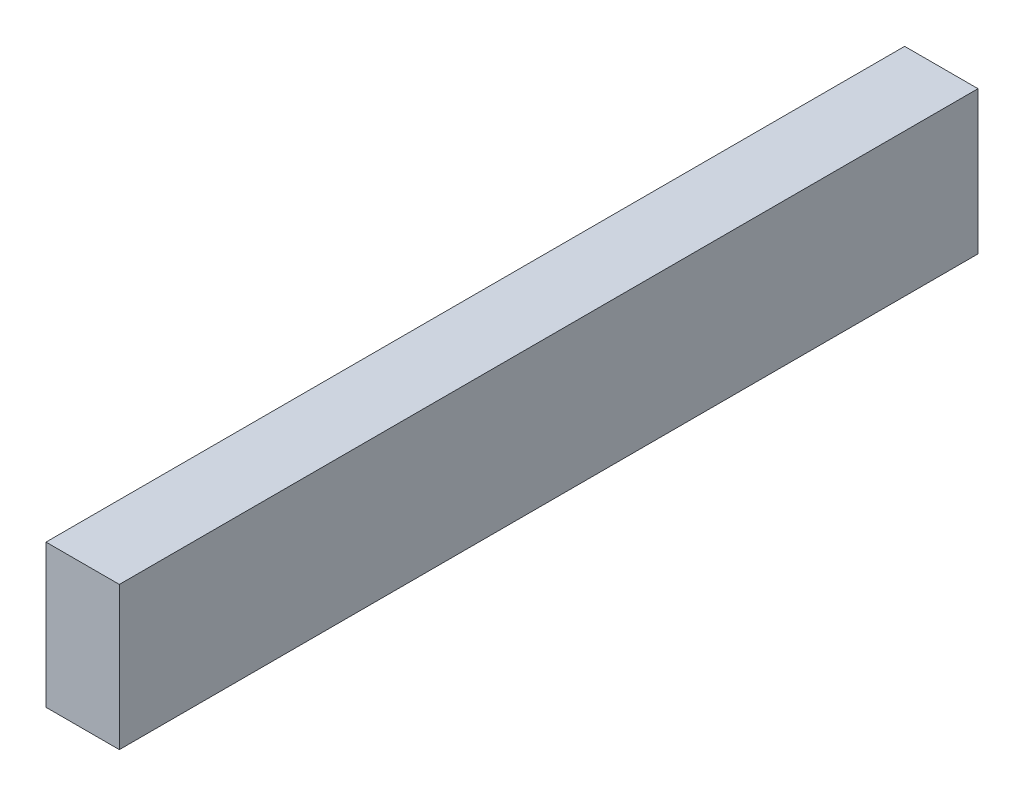
ISO-10303-21;
HEADER;
FILE_DESCRIPTION(('STEP AP214'),'2;1');
FILE_NAME('part.step','',(''),(''),'','','');
FILE_SCHEMA(('AUTOMOTIVE_DESIGN { 1 0 10303 214 1 1 1 1 }'));
ENDSEC;
DATA;
#1=APPLICATION_CONTEXT('core data for automotive mechanical design processes');
#2=APPLICATION_PROTOCOL_DEFINITION('international standard','automotive_design',2000,#1);
#3=PRODUCT_CONTEXT('',#1,'mechanical');
#4=PRODUCT('Part','Part','',(#3));
#5=PRODUCT_RELATED_PRODUCT_CATEGORY('part','',(#4));
#6=PRODUCT_DEFINITION_FORMATION('','',#4);
#7=PRODUCT_DEFINITION_CONTEXT('part definition',#1,'design');
#8=PRODUCT_DEFINITION('design','',#6,#7);
#9=PRODUCT_DEFINITION_SHAPE('','',#8);
#10=(LENGTH_UNIT() NAMED_UNIT(*) SI_UNIT(.MILLI.,.METRE.));
#11=(NAMED_UNIT(*) PLANE_ANGLE_UNIT() SI_UNIT($,.RADIAN.));
#12=(NAMED_UNIT(*) SI_UNIT($,.STERADIAN.) SOLID_ANGLE_UNIT());
#13=UNCERTAINTY_MEASURE_WITH_UNIT(LENGTH_MEASURE(1.E-05),#10,'distance_accuracy_value','');
#14=(GEOMETRIC_REPRESENTATION_CONTEXT(3) GLOBAL_UNCERTAINTY_ASSIGNED_CONTEXT((#13)) GLOBAL_UNIT_ASSIGNED_CONTEXT((#10,
#11,#12)) REPRESENTATION_CONTEXT('',''));
#15=CARTESIAN_POINT('',(0.,0.,0.));
#16=DIRECTION('',(0.,0.,1.));
#17=DIRECTION('',(1.,0.,0.));
#18=AXIS2_PLACEMENT_3D('',#15,#16,#17);
#19=CARTESIAN_POINT('',(0.,4.,0.));
#20=DIRECTION('',(1.,0.,0.));
#21=DIRECTION('',(0.,0.,-1.));
#22=AXIS2_PLACEMENT_3D('',#19,#20,#21);
#23=PLANE('',#22);
#24=DIRECTION('',(0.,0.,1.));
#25=VECTOR('',#24,1.);
#26=CARTESIAN_POINT('',(0.,0.,0.));
#27=LINE('',#26,#25);
#28=CARTESIAN_POINT('',(0.,0.,-24.));
#29=VERTEX_POINT('',#28);
#30=CARTESIAN_POINT('',(0.,0.,0.));
#31=VERTEX_POINT('',#30);
#32=EDGE_CURVE('E98',#29,#31,#27,.T.);
#33=ORIENTED_EDGE('',*,*,#32,.T.);
#34=DIRECTION('',(0.,-1.,0.));
#35=VECTOR('',#34,1.);
#36=CARTESIAN_POINT('',(0.,4.,0.));
#37=LINE('',#36,#35);
#38=CARTESIAN_POINT('',(0.,4.,0.));
#39=VERTEX_POINT('',#38);
#40=EDGE_CURVE('E11',#39,#31,#37,.T.);
#41=ORIENTED_EDGE('',*,*,#40,.F.);
#42=DIRECTION('',(0.,0.,1.));
#43=VECTOR('',#42,1.);
#44=CARTESIAN_POINT('',(0.,4.,0.));
#45=LINE('',#44,#43);
#46=CARTESIAN_POINT('',(0.,4.,-24.));
#47=VERTEX_POINT('',#46);
#48=EDGE_CURVE('E86',#47,#39,#45,.T.);
#49=ORIENTED_EDGE('',*,*,#48,.F.);
#50=DIRECTION('',(0.,-1.,0.));
#51=VECTOR('',#50,1.);
#52=CARTESIAN_POINT('',(0.,4.,-24.));
#53=LINE('',#52,#51);
#54=EDGE_CURVE('E94',#47,#29,#53,.T.);
#55=ORIENTED_EDGE('',*,*,#54,.T.);
#56=EDGE_LOOP('',(#33,#41,#49,#55));
#57=FACE_BOUND('',#56,.T.);
#58=ADVANCED_FACE('F35',(#57),#23,.F.);
#59=CARTESIAN_POINT('',(0.,4.,0.));
#60=DIRECTION('',(0.,0.,-1.));
#61=DIRECTION('',(-1.,0.,0.));
#62=AXIS2_PLACEMENT_3D('',#59,#60,#61);
#63=PLANE('',#62);
#64=DIRECTION('',(1.,0.,0.));
#65=VECTOR('',#64,1.);
#66=CARTESIAN_POINT('',(0.,0.,0.));
#67=LINE('',#66,#65);
#68=CARTESIAN_POINT('',(2.05,0.,0.));
#69=VERTEX_POINT('',#68);
#70=EDGE_CURVE('E90',#31,#69,#67,.T.);
#71=ORIENTED_EDGE('',*,*,#70,.T.);
#72=DIRECTION('',(0.,-1.,0.));
#73=VECTOR('',#72,1.);
#74=CARTESIAN_POINT('',(2.05,4.,0.));
#75=LINE('',#74,#73);
#76=CARTESIAN_POINT('',(2.05,4.,0.));
#77=VERTEX_POINT('',#76);
#78=EDGE_CURVE('E43',#77,#69,#75,.T.);
#79=ORIENTED_EDGE('',*,*,#78,.F.);
#80=DIRECTION('',(1.,0.,0.));
#81=VECTOR('',#80,1.);
#82=CARTESIAN_POINT('',(0.,4.,0.));
#83=LINE('',#82,#81);
#84=EDGE_CURVE('E81',#39,#77,#83,.T.);
#85=ORIENTED_EDGE('',*,*,#84,.F.);
#86=ORIENTED_EDGE('',*,*,#40,.T.);
#87=EDGE_LOOP('',(#71,#79,#85,#86));
#88=FACE_BOUND('',#87,.T.);
#89=ADVANCED_FACE('F89',(#88),#63,.F.);
#90=CARTESIAN_POINT('',(2.05,4.,0.));
#91=DIRECTION('',(-1.,0.,0.));
#92=DIRECTION('',(0.,0.,1.));
#93=AXIS2_PLACEMENT_3D('',#90,#91,#92);
#94=PLANE('',#93);
#95=DIRECTION('',(0.,0.,-1.));
#96=VECTOR('',#95,1.);
#97=CARTESIAN_POINT('',(2.05,0.,0.));
#98=LINE('',#97,#96);
#99=CARTESIAN_POINT('',(2.05,0.,-24.));
#100=VERTEX_POINT('',#99);
#101=EDGE_CURVE('E68',#69,#100,#98,.T.);
#102=ORIENTED_EDGE('',*,*,#101,.T.);
#103=DIRECTION('',(0.,-1.,0.));
#104=VECTOR('',#103,1.);
#105=CARTESIAN_POINT('',(2.05,4.,-24.));
#106=LINE('',#105,#104);
#107=CARTESIAN_POINT('',(2.05,4.,-24.));
#108=VERTEX_POINT('',#107);
#109=EDGE_CURVE('E91',#108,#100,#106,.T.);
#110=ORIENTED_EDGE('',*,*,#109,.F.);
#111=DIRECTION('',(0.,0.,-1.));
#112=VECTOR('',#111,1.);
#113=CARTESIAN_POINT('',(2.05,4.,0.));
#114=LINE('',#113,#112);
#115=EDGE_CURVE('E84',#77,#108,#114,.T.);
#116=ORIENTED_EDGE('',*,*,#115,.F.);
#117=ORIENTED_EDGE('',*,*,#78,.T.);
#118=EDGE_LOOP('',(#102,#110,#116,#117));
#119=FACE_BOUND('',#118,.T.);
#120=ADVANCED_FACE('F92',(#119),#94,.F.);
#121=CARTESIAN_POINT('',(0.,4.,-24.));
#122=DIRECTION('',(0.,0.,1.));
#123=DIRECTION('',(1.,0.,0.));
#124=AXIS2_PLACEMENT_3D('',#121,#122,#123);
#125=PLANE('',#124);
#126=DIRECTION('',(-1.,0.,0.));
#127=VECTOR('',#126,1.);
#128=CARTESIAN_POINT('',(0.,0.,-24.));
#129=LINE('',#128,#127);
#130=EDGE_CURVE('E74',#100,#29,#129,.T.);
#131=ORIENTED_EDGE('',*,*,#130,.T.);
#132=ORIENTED_EDGE('',*,*,#54,.F.);
#133=DIRECTION('',(-1.,0.,0.));
#134=VECTOR('',#133,1.);
#135=CARTESIAN_POINT('',(0.,4.,-24.));
#136=LINE('',#135,#134);
#137=EDGE_CURVE('E51',#108,#47,#136,.T.);
#138=ORIENTED_EDGE('',*,*,#137,.F.);
#139=ORIENTED_EDGE('',*,*,#109,.T.);
#140=EDGE_LOOP('',(#131,#132,#138,#139));
#141=FACE_BOUND('',#140,.T.);
#142=ADVANCED_FACE('F105',(#141),#125,.F.);
#143=CARTESIAN_POINT('',(0.,4.,0.));
#144=DIRECTION('',(0.,-1.,0.));
#145=DIRECTION('',(0.,0.,-1.));
#146=AXIS2_PLACEMENT_3D('',#143,#144,#145);
#147=PLANE('',#146);
#148=ORIENTED_EDGE('',*,*,#48,.T.);
#149=ORIENTED_EDGE('',*,*,#84,.T.);
#150=ORIENTED_EDGE('',*,*,#115,.T.);
#151=ORIENTED_EDGE('',*,*,#137,.T.);
#152=EDGE_LOOP('',(#148,#149,#150,#151));
#153=FACE_BOUND('',#152,.T.);
#154=ADVANCED_FACE('F82',(#153),#147,.F.);
#155=CARTESIAN_POINT('',(0.,0.,0.));
#156=DIRECTION('',(0.,-1.,0.));
#157=DIRECTION('',(0.,0.,-1.));
#158=AXIS2_PLACEMENT_3D('',#155,#156,#157);
#159=PLANE('',#158);
#160=ORIENTED_EDGE('',*,*,#32,.F.);
#161=ORIENTED_EDGE('',*,*,#130,.F.);
#162=ORIENTED_EDGE('',*,*,#101,.F.);
#163=ORIENTED_EDGE('',*,*,#70,.F.);
#164=EDGE_LOOP('',(#160,#161,#162,#163));
#165=FACE_BOUND('',#164,.T.);
#166=ADVANCED_FACE('F108',(#165),#159,.T.);
#167=CLOSED_SHELL('',(#58,#89,#120,#142,#154,#166));
#168=MANIFOLD_SOLID_BREP('B2',#167);
#169=ADVANCED_BREP_SHAPE_REPRESENTATION('',(#18,#168),#14);
#170=SHAPE_DEFINITION_REPRESENTATION(#9,#169);
ENDSEC;
END-ISO-10303-21;
